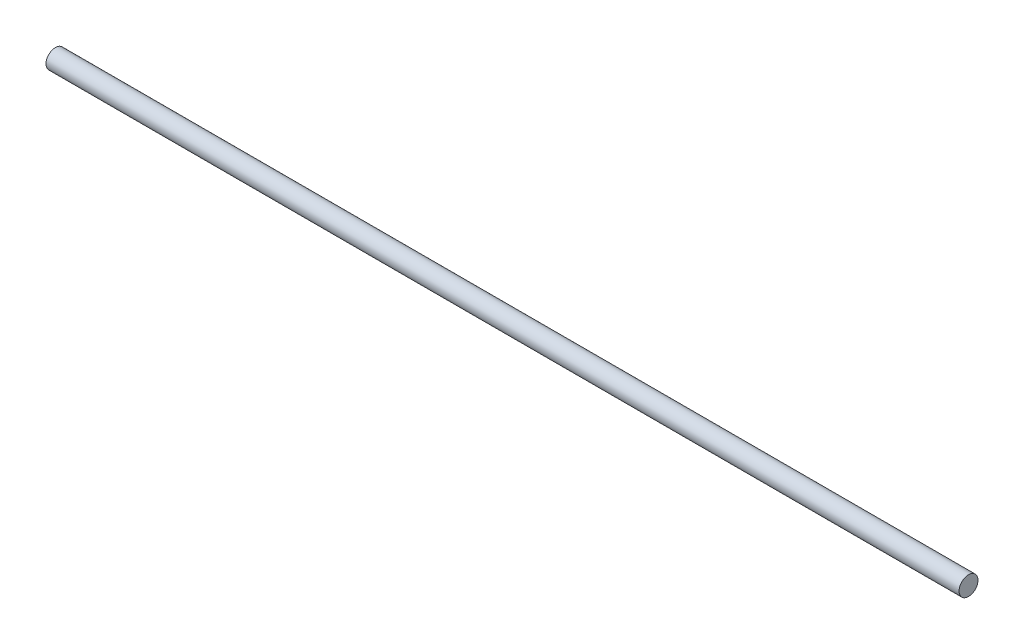
ISO-10303-21;
HEADER;
FILE_DESCRIPTION(('STEP AP214'),'2;1');
FILE_NAME('part.step','',(''),(''),'','','');
FILE_SCHEMA(('AUTOMOTIVE_DESIGN { 1 0 10303 214 1 1 1 1 }'));
ENDSEC;
DATA;
#1=APPLICATION_CONTEXT('core data for automotive mechanical design processes');
#2=APPLICATION_PROTOCOL_DEFINITION('international standard','automotive_design',2000,#1);
#3=PRODUCT_CONTEXT('',#1,'mechanical');
#4=PRODUCT('Part','Part','',(#3));
#5=PRODUCT_RELATED_PRODUCT_CATEGORY('part','',(#4));
#6=PRODUCT_DEFINITION_FORMATION('','',#4);
#7=PRODUCT_DEFINITION_CONTEXT('part definition',#1,'design');
#8=PRODUCT_DEFINITION('design','',#6,#7);
#9=PRODUCT_DEFINITION_SHAPE('','',#8);
#10=(LENGTH_UNIT() NAMED_UNIT(*) SI_UNIT(.MILLI.,.METRE.));
#11=(NAMED_UNIT(*) PLANE_ANGLE_UNIT() SI_UNIT($,.RADIAN.));
#12=(NAMED_UNIT(*) SI_UNIT($,.STERADIAN.) SOLID_ANGLE_UNIT());
#13=UNCERTAINTY_MEASURE_WITH_UNIT(LENGTH_MEASURE(1.E-05),#10,'distance_accuracy_value','');
#14=(GEOMETRIC_REPRESENTATION_CONTEXT(3) GLOBAL_UNCERTAINTY_ASSIGNED_CONTEXT((#13)) GLOBAL_UNIT_ASSIGNED_CONTEXT((#10,
#11,#12)) REPRESENTATION_CONTEXT('',''));
#15=CARTESIAN_POINT('',(0.,0.,0.));
#16=DIRECTION('',(0.,0.,1.));
#17=DIRECTION('',(1.,0.,0.));
#18=AXIS2_PLACEMENT_3D('',#15,#16,#17);
#19=CARTESIAN_POINT('',(-603.5,0.,0.));
#20=DIRECTION('',(1.,0.,0.));
#21=DIRECTION('',(0.,0.,-1.));
#22=AXIS2_PLACEMENT_3D('',#19,#20,#21);
#23=CYLINDRICAL_SURFACE('',#22,12.5);
#24=CARTESIAN_POINT('',(-603.5,0.,0.));
#25=DIRECTION('',(1.,0.,0.));
#26=DIRECTION('',(0.,0.,-1.));
#27=AXIS2_PLACEMENT_3D('',#24,#25,#26);
#28=CIRCLE('',#27,12.5);
#29=CARTESIAN_POINT('',(-603.5,0.,-12.5));
#30=VERTEX_POINT('',#29);
#31=EDGE_CURVE('E10',#30,#30,#28,.T.);
#32=ORIENTED_EDGE('',*,*,#31,.T.);
#33=EDGE_LOOP('',(#32));
#34=FACE_BOUND('',#33,.T.);
#35=CARTESIAN_POINT('',(603.5,0.,0.));
#36=DIRECTION('',(1.,0.,0.));
#37=DIRECTION('',(0.,0.,-1.));
#38=AXIS2_PLACEMENT_3D('',#35,#36,#37);
#39=CIRCLE('',#38,12.5);
#40=CARTESIAN_POINT('',(603.5,0.,-12.5));
#41=VERTEX_POINT('',#40);
#42=EDGE_CURVE('E38',#41,#41,#39,.T.);
#43=ORIENTED_EDGE('',*,*,#42,.F.);
#44=EDGE_LOOP('',(#43));
#45=FACE_BOUND('',#44,.T.);
#46=ADVANCED_FACE('F32',(#34,#45),#23,.T.);
#47=CARTESIAN_POINT('',(-603.5,0.,0.));
#48=DIRECTION('',(1.,0.,0.));
#49=DIRECTION('',(0.,0.,-1.));
#50=AXIS2_PLACEMENT_3D('',#47,#48,#49);
#51=PLANE('',#50);
#52=ORIENTED_EDGE('',*,*,#31,.F.);
#53=EDGE_LOOP('',(#52));
#54=FACE_BOUND('',#53,.T.);
#55=ADVANCED_FACE('F47',(#54),#51,.F.);
#56=CARTESIAN_POINT('',(603.5,0.,0.));
#57=DIRECTION('',(1.,0.,0.));
#58=DIRECTION('',(0.,0.,-1.));
#59=AXIS2_PLACEMENT_3D('',#56,#57,#58);
#60=PLANE('',#59);
#61=ORIENTED_EDGE('',*,*,#42,.T.);
#62=EDGE_LOOP('',(#61));
#63=FACE_BOUND('',#62,.T.);
#64=ADVANCED_FACE('F44',(#63),#60,.T.);
#65=CLOSED_SHELL('',(#46,#55,#64));
#66=MANIFOLD_SOLID_BREP('B2',#65);
#67=ADVANCED_BREP_SHAPE_REPRESENTATION('',(#18,#66),#14);
#68=SHAPE_DEFINITION_REPRESENTATION(#9,#67);
ENDSEC;
END-ISO-10303-21;
